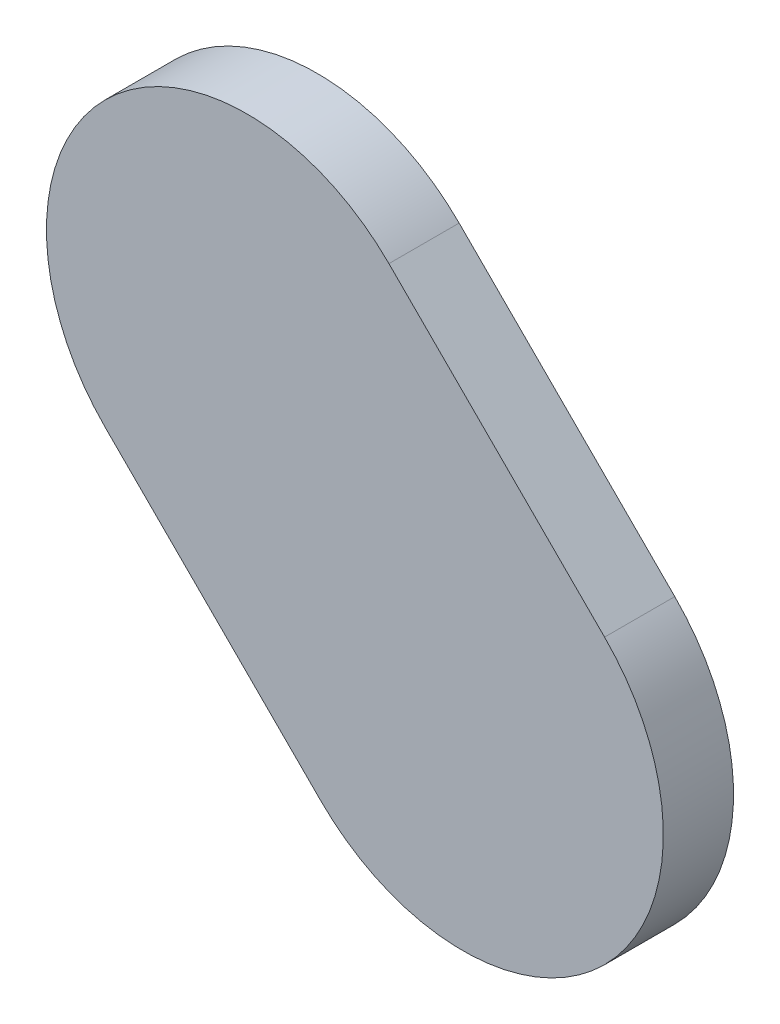
ISO-10303-21;
HEADER;
FILE_DESCRIPTION(('STEP AP214'),'2;1');
FILE_NAME('part.step','',(''),(''),'','','');
FILE_SCHEMA(('AUTOMOTIVE_DESIGN { 1 0 10303 214 1 1 1 1 }'));
ENDSEC;
DATA;
#1=APPLICATION_CONTEXT('core data for automotive mechanical design processes');
#2=APPLICATION_PROTOCOL_DEFINITION('international standard','automotive_design',2000,#1);
#3=PRODUCT_CONTEXT('',#1,'mechanical');
#4=PRODUCT('Part','Part','',(#3));
#5=PRODUCT_RELATED_PRODUCT_CATEGORY('part','',(#4));
#6=PRODUCT_DEFINITION_FORMATION('','',#4);
#7=PRODUCT_DEFINITION_CONTEXT('part definition',#1,'design');
#8=PRODUCT_DEFINITION('design','',#6,#7);
#9=PRODUCT_DEFINITION_SHAPE('','',#8);
#10=(LENGTH_UNIT() NAMED_UNIT(*) SI_UNIT(.MILLI.,.METRE.));
#11=(NAMED_UNIT(*) PLANE_ANGLE_UNIT() SI_UNIT($,.RADIAN.));
#12=(NAMED_UNIT(*) SI_UNIT($,.STERADIAN.) SOLID_ANGLE_UNIT());
#13=UNCERTAINTY_MEASURE_WITH_UNIT(LENGTH_MEASURE(1.E-05),#10,'distance_accuracy_value','');
#14=(GEOMETRIC_REPRESENTATION_CONTEXT(3) GLOBAL_UNCERTAINTY_ASSIGNED_CONTEXT((#13)) GLOBAL_UNIT_ASSIGNED_CONTEXT((#10,
#11,#12)) REPRESENTATION_CONTEXT('',''));
#15=CARTESIAN_POINT('',(0.,0.,0.));
#16=DIRECTION('',(0.,0.,1.));
#17=DIRECTION('',(1.,0.,0.));
#18=AXIS2_PLACEMENT_3D('',#15,#16,#17);
#19=CARTESIAN_POINT('',(83.52071,-108.174289,1.635));
#20=DIRECTION('',(0.,0.,1.));
#21=DIRECTION('',(1.,0.,0.));
#22=AXIS2_PLACEMENT_3D('',#19,#20,#21);
#23=PLANE('',#22);
#24=DIRECTION('',(-0.707106781186548,0.707106781186548,0.));
#25=VECTOR('',#24,1.);
#26=CARTESIAN_POINT('',(83.52071,-108.174289,1.635));
#27=LINE('',#26,#25);
#28=CARTESIAN_POINT('',(83.52071,-108.174289,1.635));
#29=VERTEX_POINT('',#28);
#30=CARTESIAN_POINT('',(83.41321,-108.066789,1.635));
#31=VERTEX_POINT('',#30);
#32=EDGE_CURVE('E99',#29,#31,#27,.T.);
#33=ORIENTED_EDGE('',*,*,#32,.T.);
#34=CARTESIAN_POINT('',(83.3424995,-108.1374995,1.635));
#35=DIRECTION('',(0.,0.,1.));
#36=DIRECTION('',(0.707106781187048,0.707106781186048,0.));
#37=AXIS2_PLACEMENT_3D('',#34,#35,#36);
#38=CIRCLE('',#37,0.09999974810218);
#39=CARTESIAN_POINT('',(83.271789,-108.20821,1.635));
#40=VERTEX_POINT('',#39);
#41=EDGE_CURVE('E78',#31,#40,#38,.T.);
#42=ORIENTED_EDGE('',*,*,#41,.T.);
#43=DIRECTION('',(0.707106781186548,-0.707106781186548,0.));
#44=VECTOR('',#43,1.);
#45=CARTESIAN_POINT('',(83.271789,-108.20821,1.635));
#46=LINE('',#45,#44);
#47=CARTESIAN_POINT('',(83.379289,-108.31571,1.635));
#48=VERTEX_POINT('',#47);
#49=EDGE_CURVE('E83',#40,#48,#46,.T.);
#50=ORIENTED_EDGE('',*,*,#49,.T.);
#51=CARTESIAN_POINT('',(83.4499995,-108.2449995,1.635));
#52=DIRECTION('',(0.,0.,1.));
#53=DIRECTION('',(-0.707106781186548,-0.707106781186548,0.));
#54=AXIS2_PLACEMENT_3D('',#51,#52,#53);
#55=CIRCLE('',#54,0.09999974810218);
#56=EDGE_CURVE('E11',#48,#29,#55,.T.);
#57=ORIENTED_EDGE('',*,*,#56,.T.);
#58=EDGE_LOOP('',(#33,#42,#50,#57));
#59=FACE_BOUND('',#58,.T.);
#60=ADVANCED_FACE('F17',(#59),#23,.T.);
#61=CARTESIAN_POINT('',(83.52071,-108.174289,1.6));
#62=DIRECTION('',(0.,0.,1.));
#63=DIRECTION('',(1.,0.,0.));
#64=AXIS2_PLACEMENT_3D('',#61,#62,#63);
#65=PLANE('',#64);
#66=CARTESIAN_POINT('',(83.4499995,-108.2449995,1.6));
#67=DIRECTION('',(0.,0.,1.));
#68=DIRECTION('',(-0.707106781186548,-0.707106781186548,0.));
#69=AXIS2_PLACEMENT_3D('',#66,#67,#68);
#70=CIRCLE('',#69,0.09999974810218);
#71=CARTESIAN_POINT('',(83.379289,-108.31571,1.6));
#72=VERTEX_POINT('',#71);
#73=CARTESIAN_POINT('',(83.52071,-108.174289,1.6));
#74=VERTEX_POINT('',#73);
#75=EDGE_CURVE('E26',#72,#74,#70,.T.);
#76=ORIENTED_EDGE('',*,*,#75,.F.);
#77=DIRECTION('',(0.707106781186548,-0.707106781186548,0.));
#78=VECTOR('',#77,1.);
#79=CARTESIAN_POINT('',(83.271789,-108.20821,1.6));
#80=LINE('',#79,#78);
#81=CARTESIAN_POINT('',(83.271789,-108.20821,1.6));
#82=VERTEX_POINT('',#81);
#83=EDGE_CURVE('E69',#82,#72,#80,.T.);
#84=ORIENTED_EDGE('',*,*,#83,.F.);
#85=CARTESIAN_POINT('',(83.3424995,-108.1374995,1.6));
#86=DIRECTION('',(0.,0.,1.));
#87=DIRECTION('',(0.707106781187048,0.707106781186048,0.));
#88=AXIS2_PLACEMENT_3D('',#85,#86,#87);
#89=CIRCLE('',#88,0.09999974810218);
#90=CARTESIAN_POINT('',(83.41321,-108.066789,1.6));
#91=VERTEX_POINT('',#90);
#92=EDGE_CURVE('E73',#91,#82,#89,.T.);
#93=ORIENTED_EDGE('',*,*,#92,.F.);
#94=DIRECTION('',(-0.707106781186548,0.707106781186548,0.));
#95=VECTOR('',#94,1.);
#96=CARTESIAN_POINT('',(83.52071,-108.174289,1.6));
#97=LINE('',#96,#95);
#98=EDGE_CURVE('E117',#74,#91,#97,.T.);
#99=ORIENTED_EDGE('',*,*,#98,.F.);
#100=EDGE_LOOP('',(#76,#84,#93,#99));
#101=FACE_BOUND('',#100,.T.);
#102=ADVANCED_FACE('F71',(#101),#65,.F.);
#103=CARTESIAN_POINT('',(83.4499995,-108.2449995,1.6));
#104=DIRECTION('',(0.,0.,-1.));
#105=DIRECTION('',(-0.707106781186548,-0.707106781186548,0.));
#106=AXIS2_PLACEMENT_3D('',#103,#104,#105);
#107=CYLINDRICAL_SURFACE('',#106,0.09999974810218);
#108=ORIENTED_EDGE('',*,*,#75,.T.);
#109=DIRECTION('',(0.,0.,1.));
#110=VECTOR('',#109,1.);
#111=CARTESIAN_POINT('',(83.52071,-108.174289,1.6));
#112=LINE('',#111,#110);
#113=EDGE_CURVE('E93',#74,#29,#112,.T.);
#114=ORIENTED_EDGE('',*,*,#113,.T.);
#115=ORIENTED_EDGE('',*,*,#56,.F.);
#116=DIRECTION('',(0.,0.,1.));
#117=VECTOR('',#116,1.);
#118=CARTESIAN_POINT('',(83.379289,-108.31571,1.6));
#119=LINE('',#118,#117);
#120=EDGE_CURVE('E20',#72,#48,#119,.T.);
#121=ORIENTED_EDGE('',*,*,#120,.F.);
#122=EDGE_LOOP('',(#108,#114,#115,#121));
#123=FACE_BOUND('',#122,.T.);
#124=ADVANCED_FACE('F112',(#123),#107,.T.);
#125=CARTESIAN_POINT('',(83.271789,-108.20821,1.6));
#126=DIRECTION('',(0.707106781186548,0.707106781186548,0.));
#127=DIRECTION('',(0.,0.,-1.));
#128=AXIS2_PLACEMENT_3D('',#125,#126,#127);
#129=PLANE('',#128);
#130=ORIENTED_EDGE('',*,*,#83,.T.);
#131=ORIENTED_EDGE('',*,*,#120,.T.);
#132=ORIENTED_EDGE('',*,*,#49,.F.);
#133=DIRECTION('',(0.,0.,1.));
#134=VECTOR('',#133,1.);
#135=CARTESIAN_POINT('',(83.271789,-108.20821,1.6));
#136=LINE('',#135,#134);
#137=EDGE_CURVE('E81',#82,#40,#136,.T.);
#138=ORIENTED_EDGE('',*,*,#137,.F.);
#139=EDGE_LOOP('',(#130,#131,#132,#138));
#140=FACE_BOUND('',#139,.T.);
#141=ADVANCED_FACE('F82',(#140),#129,.F.);
#142=CARTESIAN_POINT('',(83.3424995,-108.1374995,1.6));
#143=DIRECTION('',(0.,0.,-1.));
#144=DIRECTION('',(0.707106781187048,0.707106781186048,0.));
#145=AXIS2_PLACEMENT_3D('',#142,#143,#144);
#146=CYLINDRICAL_SURFACE('',#145,0.09999974810218);
#147=ORIENTED_EDGE('',*,*,#92,.T.);
#148=ORIENTED_EDGE('',*,*,#137,.T.);
#149=ORIENTED_EDGE('',*,*,#41,.F.);
#150=DIRECTION('',(0.,0.,1.));
#151=VECTOR('',#150,1.);
#152=CARTESIAN_POINT('',(83.41321,-108.066789,1.6));
#153=LINE('',#152,#151);
#154=EDGE_CURVE('E90',#91,#31,#153,.T.);
#155=ORIENTED_EDGE('',*,*,#154,.F.);
#156=EDGE_LOOP('',(#147,#148,#149,#155));
#157=FACE_BOUND('',#156,.T.);
#158=ADVANCED_FACE('F88',(#157),#146,.T.);
#159=CARTESIAN_POINT('',(83.52071,-108.174289,1.6));
#160=DIRECTION('',(-0.707106781186548,-0.707106781186548,0.));
#161=DIRECTION('',(-0.707106781186548,0.707106781186548,0.));
#162=AXIS2_PLACEMENT_3D('',#159,#160,#161);
#163=PLANE('',#162);
#164=ORIENTED_EDGE('',*,*,#98,.T.);
#165=ORIENTED_EDGE('',*,*,#154,.T.);
#166=ORIENTED_EDGE('',*,*,#32,.F.);
#167=ORIENTED_EDGE('',*,*,#113,.F.);
#168=EDGE_LOOP('',(#164,#165,#166,#167));
#169=FACE_BOUND('',#168,.T.);
#170=ADVANCED_FACE('F116',(#169),#163,.F.);
#171=CLOSED_SHELL('',(#60,#102,#124,#141,#158,#170));
#172=MANIFOLD_SOLID_BREP('B1',#171);
#173=ADVANCED_BREP_SHAPE_REPRESENTATION('',(#18,#172),#14);
#174=SHAPE_DEFINITION_REPRESENTATION(#9,#173);
ENDSEC;
END-ISO-10303-21;
